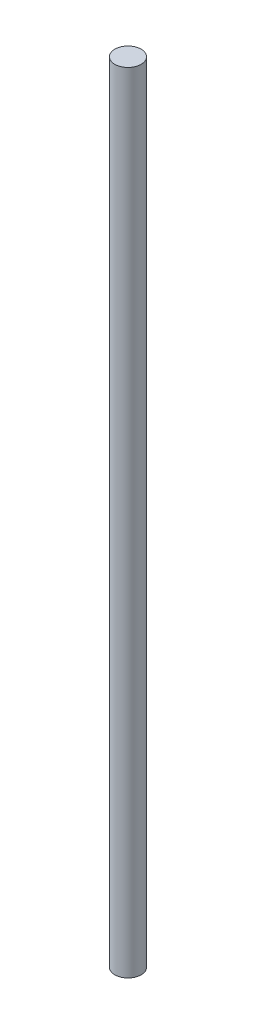
ISO-10303-21;
HEADER;
FILE_DESCRIPTION(('STEP AP214'),'2;1');
FILE_NAME('part.step','',(''),(''),'','','');
FILE_SCHEMA(('AUTOMOTIVE_DESIGN { 1 0 10303 214 1 1 1 1 }'));
ENDSEC;
DATA;
#1=APPLICATION_CONTEXT('core data for automotive mechanical design processes');
#2=APPLICATION_PROTOCOL_DEFINITION('international standard','automotive_design',2000,#1);
#3=PRODUCT_CONTEXT('',#1,'mechanical');
#4=PRODUCT('Part','Part','',(#3));
#5=PRODUCT_RELATED_PRODUCT_CATEGORY('part','',(#4));
#6=PRODUCT_DEFINITION_FORMATION('','',#4);
#7=PRODUCT_DEFINITION_CONTEXT('part definition',#1,'design');
#8=PRODUCT_DEFINITION('design','',#6,#7);
#9=PRODUCT_DEFINITION_SHAPE('','',#8);
#10=(LENGTH_UNIT() NAMED_UNIT(*) SI_UNIT(.MILLI.,.METRE.));
#11=(NAMED_UNIT(*) PLANE_ANGLE_UNIT() SI_UNIT($,.RADIAN.));
#12=(NAMED_UNIT(*) SI_UNIT($,.STERADIAN.) SOLID_ANGLE_UNIT());
#13=UNCERTAINTY_MEASURE_WITH_UNIT(LENGTH_MEASURE(1.E-05),#10,'distance_accuracy_value','');
#14=(GEOMETRIC_REPRESENTATION_CONTEXT(3) GLOBAL_UNCERTAINTY_ASSIGNED_CONTEXT((#13)) GLOBAL_UNIT_ASSIGNED_CONTEXT((#10,
#11,#12)) REPRESENTATION_CONTEXT('',''));
#15=CARTESIAN_POINT('',(0.,0.,0.));
#16=DIRECTION('',(0.,0.,1.));
#17=DIRECTION('',(1.,0.,0.));
#18=AXIS2_PLACEMENT_3D('',#15,#16,#17);
#19=CARTESIAN_POINT('',(-50.6824617371109,1200.,29.8527468209653));
#20=DIRECTION('',(0.,-1.,0.));
#21=DIRECTION('',(0.,0.,-1.));
#22=AXIS2_PLACEMENT_3D('',#19,#20,#21);
#23=CYLINDRICAL_SURFACE('',#22,20.);
#24=CARTESIAN_POINT('',(-50.6824617371109,1200.,29.8527468209653));
#25=DIRECTION('',(0.,1.,0.));
#26=DIRECTION('',(0.,0.,1.));
#27=AXIS2_PLACEMENT_3D('',#24,#25,#26);
#28=CIRCLE('',#27,20.);
#29=CARTESIAN_POINT('',(-50.6824617371109,1200.,49.8527468209653));
#30=VERTEX_POINT('',#29);
#31=EDGE_CURVE('E10',#30,#30,#28,.T.);
#32=ORIENTED_EDGE('',*,*,#31,.F.);
#33=EDGE_LOOP('',(#32));
#34=FACE_BOUND('',#33,.T.);
#35=CARTESIAN_POINT('',(-50.6824617371109,0.,29.8527468209653));
#36=DIRECTION('',(0.,1.,0.));
#37=DIRECTION('',(0.,0.,1.));
#38=AXIS2_PLACEMENT_3D('',#35,#36,#37);
#39=CIRCLE('',#38,20.);
#40=CARTESIAN_POINT('',(-50.6824617371109,0.,49.8527468209653));
#41=VERTEX_POINT('',#40);
#42=EDGE_CURVE('E40',#41,#41,#39,.T.);
#43=ORIENTED_EDGE('',*,*,#42,.T.);
#44=EDGE_LOOP('',(#43));
#45=FACE_BOUND('',#44,.T.);
#46=ADVANCED_FACE('F37',(#34,#45),#23,.T.);
#47=CARTESIAN_POINT('',(-50.6824617371109,1200.,29.8527468209653));
#48=DIRECTION('',(0.,1.,0.));
#49=DIRECTION('',(0.,0.,1.));
#50=AXIS2_PLACEMENT_3D('',#47,#48,#49);
#51=PLANE('',#50);
#52=ORIENTED_EDGE('',*,*,#31,.T.);
#53=EDGE_LOOP('',(#52));
#54=FACE_BOUND('',#53,.T.);
#55=ADVANCED_FACE('F52',(#54),#51,.T.);
#56=CARTESIAN_POINT('',(-50.6824617371109,0.,29.8527468209653));
#57=DIRECTION('',(0.,1.,0.));
#58=DIRECTION('',(0.,0.,1.));
#59=AXIS2_PLACEMENT_3D('',#56,#57,#58);
#60=PLANE('',#59);
#61=ORIENTED_EDGE('',*,*,#42,.F.);
#62=EDGE_LOOP('',(#61));
#63=FACE_BOUND('',#62,.T.);
#64=ADVANCED_FACE('F50',(#63),#60,.F.);
#65=CLOSED_SHELL('',(#46,#55,#64));
#66=MANIFOLD_SOLID_BREP('B2',#65);
#67=ADVANCED_BREP_SHAPE_REPRESENTATION('',(#18,#66),#14);
#68=SHAPE_DEFINITION_REPRESENTATION(#9,#67);
ENDSEC;
END-ISO-10303-21;
